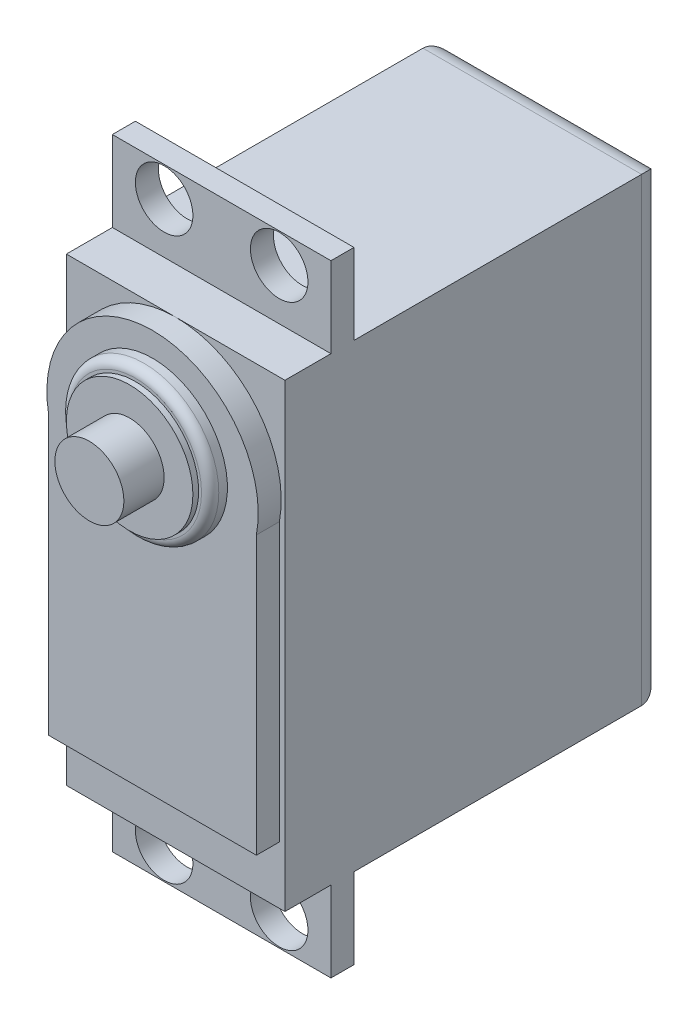
ISO-10303-21;
HEADER;
FILE_DESCRIPTION(('STEP AP214'),'2;1');
FILE_NAME('part.step','',(''),(''),'','','');
FILE_SCHEMA(('AUTOMOTIVE_DESIGN { 1 0 10303 214 1 1 1 1 }'));
ENDSEC;
DATA;
#1=APPLICATION_CONTEXT('core data for automotive mechanical design processes');
#2=APPLICATION_PROTOCOL_DEFINITION('international standard','automotive_design',2000,#1);
#3=PRODUCT_CONTEXT('',#1,'mechanical');
#4=PRODUCT('Part','Part','',(#3));
#5=PRODUCT_RELATED_PRODUCT_CATEGORY('part','',(#4));
#6=PRODUCT_DEFINITION_FORMATION('','',#4);
#7=PRODUCT_DEFINITION_CONTEXT('part definition',#1,'design');
#8=PRODUCT_DEFINITION('design','',#6,#7);
#9=PRODUCT_DEFINITION_SHAPE('','',#8);
#10=(LENGTH_UNIT() NAMED_UNIT(*) SI_UNIT(.MILLI.,.METRE.));
#11=(NAMED_UNIT(*) PLANE_ANGLE_UNIT() SI_UNIT($,.RADIAN.));
#12=(NAMED_UNIT(*) SI_UNIT($,.STERADIAN.) SOLID_ANGLE_UNIT());
#13=UNCERTAINTY_MEASURE_WITH_UNIT(LENGTH_MEASURE(1.E-05),#10,'distance_accuracy_value','');
#14=(GEOMETRIC_REPRESENTATION_CONTEXT(3) GLOBAL_UNCERTAINTY_ASSIGNED_CONTEXT((#13)) GLOBAL_UNIT_ASSIGNED_CONTEXT((#10,
#11,#12)) REPRESENTATION_CONTEXT('',''));
#15=CARTESIAN_POINT('',(0.,0.,0.));
#16=DIRECTION('',(0.,0.,1.));
#17=DIRECTION('',(1.,0.,0.));
#18=AXIS2_PLACEMENT_3D('',#15,#16,#17);
#19=CARTESIAN_POINT('',(0.,31.409074500075,4.));
#20=DIRECTION('',(0.,0.,1.));
#21=DIRECTION('',(1.,0.,0.));
#22=AXIS2_PLACEMENT_3D('',#19,#20,#21);
#23=PLANE('',#22);
#24=CARTESIAN_POINT('',(0.,31.409074500075,4.));
#25=DIRECTION('',(0.,0.,1.));
#26=DIRECTION('',(1.,0.,0.));
#27=AXIS2_PLACEMENT_3D('',#24,#25,#26);
#28=CIRCLE('',#27,5.5);
#29=CARTESIAN_POINT('',(5.5,31.409074500075,4.));
#30=VERTEX_POINT('',#29);
#31=EDGE_CURVE('E318',#30,#30,#28,.T.);
#32=ORIENTED_EDGE('',*,*,#31,.T.);
#33=EDGE_LOOP('',(#32));
#34=FACE_BOUND('',#33,.T.);
#35=CARTESIAN_POINT('',(0.,31.409074500075,4.));
#36=DIRECTION('',(0.,0.,1.));
#37=DIRECTION('',(1.,0.,0.));
#38=AXIS2_PLACEMENT_3D('',#35,#36,#37);
#39=CIRCLE('',#38,3.);
#40=CARTESIAN_POINT('',(3.,31.409074500075,4.));
#41=VERTEX_POINT('',#40);
#42=EDGE_CURVE('E523',#41,#41,#39,.T.);
#43=ORIENTED_EDGE('',*,*,#42,.F.);
#44=EDGE_LOOP('',(#43));
#45=FACE_BOUND('',#44,.T.);
#46=ADVANCED_FACE('F34',(#34,#45),#23,.T.);
#47=CARTESIAN_POINT('',(0.,31.409074500075,3.5));
#48=DIRECTION('',(0.,0.,1.));
#49=DIRECTION('',(1.,0.,0.));
#50=AXIS2_PLACEMENT_3D('',#47,#48,#49);
#51=PLANE('',#50);
#52=CARTESIAN_POINT('',(0.,31.409074500075,3.5));
#53=DIRECTION('',(0.,0.,1.));
#54=DIRECTION('',(1.,0.,0.));
#55=AXIS2_PLACEMENT_3D('',#52,#53,#54);
#56=CIRCLE('',#55,5.75);
#57=CARTESIAN_POINT('',(5.75,31.409074500075,3.5));
#58=VERTEX_POINT('',#57);
#59=EDGE_CURVE('E42',#58,#58,#56,.T.);
#60=ORIENTED_EDGE('',*,*,#59,.T.);
#61=EDGE_LOOP('',(#60));
#62=FACE_BOUND('',#61,.T.);
#63=CARTESIAN_POINT('',(0.,31.409074500075,3.5));
#64=DIRECTION('',(0.,0.,1.));
#65=DIRECTION('',(1.,0.,0.));
#66=AXIS2_PLACEMENT_3D('',#63,#64,#65);
#67=CIRCLE('',#66,5.5);
#68=CARTESIAN_POINT('',(5.5,31.409074500075,3.5));
#69=VERTEX_POINT('',#68);
#70=EDGE_CURVE('E518',#69,#69,#67,.T.);
#71=ORIENTED_EDGE('',*,*,#70,.F.);
#72=EDGE_LOOP('',(#71));
#73=FACE_BOUND('',#72,.T.);
#74=ADVANCED_FACE('F330',(#62,#73),#51,.T.);
#75=CARTESIAN_POINT('',(-0.00799327561285847,30.8138414603454,2.));
#76=DIRECTION('',(0.,0.,-1.));
#77=DIRECTION('',(-1.,0.,0.));
#78=AXIS2_PLACEMENT_3D('',#75,#76,#77);
#79=PLANE('',#78);
#80=DIRECTION('',(0.,-1.,0.));
#81=VECTOR('',#80,1.);
#82=CARTESIAN_POINT('',(-9.03493235362916,5.,2.));
#83=LINE('',#82,#81);
#84=CARTESIAN_POINT('',(-9.03493235362916,29.1109381755252,2.));
#85=VERTEX_POINT('',#84);
#86=CARTESIAN_POINT('',(-9.03493235362916,5.,2.));
#87=VERTEX_POINT('',#86);
#88=EDGE_CURVE('E175',#85,#87,#83,.T.);
#89=ORIENTED_EDGE('',*,*,#88,.T.);
#90=DIRECTION('',(1.,0.,0.));
#91=VECTOR('',#90,1.);
#92=CARTESIAN_POINT('',(-9.03493235362916,5.,2.));
#93=LINE('',#92,#91);
#94=CARTESIAN_POINT('',(9.01894580240345,5.,2.));
#95=VERTEX_POINT('',#94);
#96=EDGE_CURVE('E163',#87,#95,#93,.T.);
#97=ORIENTED_EDGE('',*,*,#96,.T.);
#98=DIRECTION('',(0.,1.,0.));
#99=VECTOR('',#98,1.);
#100=CARTESIAN_POINT('',(9.01894580240345,5.,2.));
#101=LINE('',#100,#99);
#102=CARTESIAN_POINT('',(9.01894580240345,29.1109381755252,2.));
#103=VERTEX_POINT('',#102);
#104=EDGE_CURVE('E174',#95,#103,#101,.T.);
#105=ORIENTED_EDGE('',*,*,#104,.T.);
#106=CARTESIAN_POINT('',(-0.00799327561285847,30.8138414603454,2.));
#107=DIRECTION('',(0.,0.,1.));
#108=DIRECTION('',(-1.,0.,0.));
#109=AXIS2_PLACEMENT_3D('',#106,#107,#108);
#110=CIRCLE('',#109,9.18615853965461);
#111=EDGE_CURVE('E181',#103,#85,#110,.T.);
#112=ORIENTED_EDGE('',*,*,#111,.T.);
#113=EDGE_LOOP('',(#89,#97,#105,#112));
#114=FACE_BOUND('',#113,.T.);
#115=CARTESIAN_POINT('',(0.,31.409074500075,2.));
#116=DIRECTION('',(0.,0.,-1.));
#117=DIRECTION('',(-1.,0.,0.));
#118=AXIS2_PLACEMENT_3D('',#115,#116,#117);
#119=CIRCLE('',#118,6.5);
#120=CARTESIAN_POINT('',(-6.5,31.409074500075,2.));
#121=VERTEX_POINT('',#120);
#122=EDGE_CURVE('E314',#121,#121,#119,.F.);
#123=ORIENTED_EDGE('',*,*,#122,.F.);
#124=EDGE_LOOP('',(#123));
#125=FACE_BOUND('',#124,.T.);
#126=ADVANCED_FACE('F178',(#114,#125),#79,.F.);
#127=CARTESIAN_POINT('',(9.5,0.,0.));
#128=DIRECTION('',(0.,0.,-1.));
#129=DIRECTION('',(-1.,0.,0.));
#130=AXIS2_PLACEMENT_3D('',#127,#128,#129);
#131=PLANE('',#130);
#132=CARTESIAN_POINT('',(-0.00799327561285847,30.8138414603454,0.));
#133=DIRECTION('',(0.,0.,1.));
#134=DIRECTION('',(-1.,0.,0.));
#135=AXIS2_PLACEMENT_3D('',#132,#133,#134);
#136=CIRCLE('',#135,9.18615853965461);
#137=CARTESIAN_POINT('',(-0.00799327561285847,40.,0.));
#138=VERTEX_POINT('',#137);
#139=CARTESIAN_POINT('',(-9.03493235362916,29.1109381755252,0.));
#140=VERTEX_POINT('',#139);
#141=EDGE_CURVE('E293',#138,#140,#136,.T.);
#142=ORIENTED_EDGE('',*,*,#141,.F.);
#143=DIRECTION('',(-1.,0.,0.));
#144=VECTOR('',#143,1.);
#145=CARTESIAN_POINT('',(9.5,40.,0.));
#146=LINE('',#145,#144);
#147=CARTESIAN_POINT('',(-9.5,40.,0.));
#148=VERTEX_POINT('',#147);
#149=EDGE_CURVE('E239',#138,#148,#146,.T.);
#150=ORIENTED_EDGE('',*,*,#149,.T.);
#151=DIRECTION('',(0.,-1.,0.));
#152=VECTOR('',#151,1.);
#153=CARTESIAN_POINT('',(-9.5,0.,0.));
#154=LINE('',#153,#152);
#155=CARTESIAN_POINT('',(-9.5,0.,0.));
#156=VERTEX_POINT('',#155);
#157=EDGE_CURVE('E214',#148,#156,#154,.T.);
#158=ORIENTED_EDGE('',*,*,#157,.T.);
#159=DIRECTION('',(-1.,0.,0.));
#160=VECTOR('',#159,1.);
#161=CARTESIAN_POINT('',(9.5,0.,0.));
#162=LINE('',#161,#160);
#163=CARTESIAN_POINT('',(9.5,0.,0.));
#164=VERTEX_POINT('',#163);
#165=EDGE_CURVE('E290',#164,#156,#162,.T.);
#166=ORIENTED_EDGE('',*,*,#165,.F.);
#167=DIRECTION('',(0.,-1.,0.));
#168=VECTOR('',#167,1.);
#169=CARTESIAN_POINT('',(9.5,0.,0.));
#170=LINE('',#169,#168);
#171=CARTESIAN_POINT('',(9.5,40.,0.));
#172=VERTEX_POINT('',#171);
#173=EDGE_CURVE('E215',#172,#164,#170,.T.);
#174=ORIENTED_EDGE('',*,*,#173,.F.);
#175=EDGE_CURVE('E263',#172,#138,#146,.T.);
#176=ORIENTED_EDGE('',*,*,#175,.T.);
#177=CARTESIAN_POINT('',(9.01894580240345,29.1109381755252,0.));
#178=VERTEX_POINT('',#177);
#179=EDGE_CURVE('E185',#178,#138,#136,.T.);
#180=ORIENTED_EDGE('',*,*,#179,.F.);
#181=DIRECTION('',(0.,1.,0.));
#182=VECTOR('',#181,1.);
#183=CARTESIAN_POINT('',(9.01894580240345,5.,0.));
#184=LINE('',#183,#182);
#185=CARTESIAN_POINT('',(9.01894580240345,5.,0.));
#186=VERTEX_POINT('',#185);
#187=EDGE_CURVE('E507',#186,#178,#184,.T.);
#188=ORIENTED_EDGE('',*,*,#187,.F.);
#189=DIRECTION('',(1.,0.,0.));
#190=VECTOR('',#189,1.);
#191=CARTESIAN_POINT('',(-9.03493235362916,5.,0.));
#192=LINE('',#191,#190);
#193=CARTESIAN_POINT('',(-9.03493235362916,5.,0.));
#194=VERTEX_POINT('',#193);
#195=EDGE_CURVE('E509',#194,#186,#192,.T.);
#196=ORIENTED_EDGE('',*,*,#195,.F.);
#197=DIRECTION('',(0.,-1.,0.));
#198=VECTOR('',#197,1.);
#199=CARTESIAN_POINT('',(-9.03493235362916,5.,0.));
#200=LINE('',#199,#198);
#201=EDGE_CURVE('E188',#140,#194,#200,.T.);
#202=ORIENTED_EDGE('',*,*,#201,.F.);
#203=EDGE_LOOP('',(#142,#150,#158,#166,#174,#176,#180,#188,#196,#202));
#204=FACE_BOUND('',#203,.T.);
#205=ADVANCED_FACE('F362',(#204),#131,.F.);
#206=CARTESIAN_POINT('',(9.5,0.,0.));
#207=DIRECTION('',(0.,1.,0.));
#208=DIRECTION('',(0.,0.,1.));
#209=AXIS2_PLACEMENT_3D('',#206,#207,#208);
#210=PLANE('',#209);
#211=DIRECTION('',(0.,0.,-1.));
#212=VECTOR('',#211,1.);
#213=CARTESIAN_POINT('',(-9.5,0.,0.));
#214=LINE('',#213,#212);
#215=CARTESIAN_POINT('',(-9.5,0.,-4.));
#216=VERTEX_POINT('',#215);
#217=EDGE_CURVE('E242',#156,#216,#214,.T.);
#218=ORIENTED_EDGE('',*,*,#217,.T.);
#219=DIRECTION('',(-1.,0.,0.));
#220=VECTOR('',#219,1.);
#221=CARTESIAN_POINT('',(9.5,0.,-4.));
#222=LINE('',#221,#220);
#223=CARTESIAN_POINT('',(9.5,0.,-4.));
#224=VERTEX_POINT('',#223);
#225=EDGE_CURVE('E287',#224,#216,#222,.T.);
#226=ORIENTED_EDGE('',*,*,#225,.F.);
#227=DIRECTION('',(0.,0.,-1.));
#228=VECTOR('',#227,1.);
#229=CARTESIAN_POINT('',(9.5,0.,0.));
#230=LINE('',#229,#228);
#231=EDGE_CURVE('E218',#164,#224,#230,.T.);
#232=ORIENTED_EDGE('',*,*,#231,.F.);
#233=ORIENTED_EDGE('',*,*,#165,.T.);
#234=EDGE_LOOP('',(#218,#226,#232,#233));
#235=FACE_BOUND('',#234,.T.);
#236=ADVANCED_FACE('F437',(#235),#210,.F.);
#237=CARTESIAN_POINT('',(9.5,0.,-4.));
#238=DIRECTION('',(0.,0.,-1.));
#239=DIRECTION('',(0.,1.,0.));
#240=AXIS2_PLACEMENT_3D('',#237,#238,#239);
#241=PLANE('',#240);
#242=CARTESIAN_POINT('',(-5.,-4.4,-4.));
#243=DIRECTION('',(0.,0.,1.));
#244=DIRECTION('',(1.,0.,0.));
#245=AXIS2_PLACEMENT_3D('',#242,#243,#244);
#246=CIRCLE('',#245,2.5);
#247=CARTESIAN_POINT('',(-2.5,-4.4,-4.));
#248=VERTEX_POINT('',#247);
#249=EDGE_CURVE('E189',#248,#248,#246,.T.);
#250=ORIENTED_EDGE('',*,*,#249,.F.);
#251=EDGE_LOOP('',(#250));
#252=FACE_BOUND('',#251,.T.);
#253=CARTESIAN_POINT('',(5.,-4.4,-4.));
#254=DIRECTION('',(0.,0.,1.));
#255=DIRECTION('',(-1.,0.,0.));
#256=AXIS2_PLACEMENT_3D('',#253,#254,#255);
#257=CIRCLE('',#256,2.5);
#258=CARTESIAN_POINT('',(2.5,-4.4,-4.));
#259=VERTEX_POINT('',#258);
#260=EDGE_CURVE('E198',#259,#259,#257,.T.);
#261=ORIENTED_EDGE('',*,*,#260,.F.);
#262=EDGE_LOOP('',(#261));
#263=FACE_BOUND('',#262,.T.);
#264=DIRECTION('',(0.,-1.,0.));
#265=VECTOR('',#264,1.);
#266=CARTESIAN_POINT('',(-9.5,0.,-4.));
#267=LINE('',#266,#265);
#268=CARTESIAN_POINT('',(-9.5,-7.,-4.));
#269=VERTEX_POINT('',#268);
#270=EDGE_CURVE('E244',#216,#269,#267,.T.);
#271=ORIENTED_EDGE('',*,*,#270,.T.);
#272=DIRECTION('',(-1.,0.,0.));
#273=VECTOR('',#272,1.);
#274=CARTESIAN_POINT('',(9.5,-7.,-4.));
#275=LINE('',#274,#273);
#276=CARTESIAN_POINT('',(9.5,-7.,-4.));
#277=VERTEX_POINT('',#276);
#278=EDGE_CURVE('E284',#277,#269,#275,.T.);
#279=ORIENTED_EDGE('',*,*,#278,.F.);
#280=DIRECTION('',(0.,-1.,0.));
#281=VECTOR('',#280,1.);
#282=CARTESIAN_POINT('',(9.5,0.,-4.));
#283=LINE('',#282,#281);
#284=EDGE_CURVE('E221',#224,#277,#283,.T.);
#285=ORIENTED_EDGE('',*,*,#284,.F.);
#286=ORIENTED_EDGE('',*,*,#225,.T.);
#287=EDGE_LOOP('',(#271,#279,#285,#286));
#288=FACE_BOUND('',#287,.T.);
#289=ADVANCED_FACE('F433',(#252,#263,#288),#241,.F.);
#290=CARTESIAN_POINT('',(9.5,-7.,-4.));
#291=DIRECTION('',(0.,1.,0.));
#292=DIRECTION('',(0.,0.,1.));
#293=AXIS2_PLACEMENT_3D('',#290,#291,#292);
#294=PLANE('',#293);
#295=DIRECTION('',(0.,0.,-1.));
#296=VECTOR('',#295,1.);
#297=CARTESIAN_POINT('',(-9.5,-7.,-4.));
#298=LINE('',#297,#296);
#299=CARTESIAN_POINT('',(-9.5,-7.,-6.));
#300=VERTEX_POINT('',#299);
#301=EDGE_CURVE('E246',#269,#300,#298,.T.);
#302=ORIENTED_EDGE('',*,*,#301,.T.);
#303=DIRECTION('',(-1.,0.,0.));
#304=VECTOR('',#303,1.);
#305=CARTESIAN_POINT('',(9.5,-7.,-6.));
#306=LINE('',#305,#304);
#307=CARTESIAN_POINT('',(9.5,-7.,-6.));
#308=VERTEX_POINT('',#307);
#309=EDGE_CURVE('E281',#308,#300,#306,.T.);
#310=ORIENTED_EDGE('',*,*,#309,.F.);
#311=DIRECTION('',(0.,0.,-1.));
#312=VECTOR('',#311,1.);
#313=CARTESIAN_POINT('',(9.5,-7.,-4.));
#314=LINE('',#313,#312);
#315=EDGE_CURVE('E223',#277,#308,#314,.T.);
#316=ORIENTED_EDGE('',*,*,#315,.F.);
#317=ORIENTED_EDGE('',*,*,#278,.T.);
#318=EDGE_LOOP('',(#302,#310,#316,#317));
#319=FACE_BOUND('',#318,.T.);
#320=ADVANCED_FACE('F429',(#319),#294,.F.);
#321=CARTESIAN_POINT('',(9.5,-7.,-6.));
#322=DIRECTION('',(0.,0.,1.));
#323=DIRECTION('',(1.,0.,0.));
#324=AXIS2_PLACEMENT_3D('',#321,#322,#323);
#325=PLANE('',#324);
#326=CARTESIAN_POINT('',(-5.,-4.4,-6.));
#327=DIRECTION('',(0.,0.,1.));
#328=DIRECTION('',(1.,0.,0.));
#329=AXIS2_PLACEMENT_3D('',#326,#327,#328);
#330=CIRCLE('',#329,2.5);
#331=CARTESIAN_POINT('',(-2.5,-4.4,-6.));
#332=VERTEX_POINT('',#331);
#333=EDGE_CURVE('E192',#332,#332,#330,.T.);
#334=ORIENTED_EDGE('',*,*,#333,.T.);
#335=EDGE_LOOP('',(#334));
#336=FACE_BOUND('',#335,.T.);
#337=CARTESIAN_POINT('',(5.,-4.4,-6.));
#338=DIRECTION('',(0.,0.,1.));
#339=DIRECTION('',(1.,0.,0.));
#340=AXIS2_PLACEMENT_3D('',#337,#338,#339);
#341=CIRCLE('',#340,2.5);
#342=CARTESIAN_POINT('',(7.5,-4.4,-6.));
#343=VERTEX_POINT('',#342);
#344=EDGE_CURVE('E201',#343,#343,#341,.T.);
#345=ORIENTED_EDGE('',*,*,#344,.T.);
#346=EDGE_LOOP('',(#345));
#347=FACE_BOUND('',#346,.T.);
#348=DIRECTION('',(0.,1.,0.));
#349=VECTOR('',#348,1.);
#350=CARTESIAN_POINT('',(-9.5,-7.,-6.));
#351=LINE('',#350,#349);
#352=CARTESIAN_POINT('',(-9.5,0.,-6.));
#353=VERTEX_POINT('',#352);
#354=EDGE_CURVE('E248',#300,#353,#351,.T.);
#355=ORIENTED_EDGE('',*,*,#354,.T.);
#356=DIRECTION('',(-1.,0.,0.));
#357=VECTOR('',#356,1.);
#358=CARTESIAN_POINT('',(9.5,0.,-6.));
#359=LINE('',#358,#357);
#360=CARTESIAN_POINT('',(9.5,0.,-6.));
#361=VERTEX_POINT('',#360);
#362=EDGE_CURVE('E278',#361,#353,#359,.T.);
#363=ORIENTED_EDGE('',*,*,#362,.F.);
#364=DIRECTION('',(0.,1.,0.));
#365=VECTOR('',#364,1.);
#366=CARTESIAN_POINT('',(9.5,-7.,-6.));
#367=LINE('',#366,#365);
#368=EDGE_CURVE('E225',#308,#361,#367,.T.);
#369=ORIENTED_EDGE('',*,*,#368,.F.);
#370=ORIENTED_EDGE('',*,*,#309,.T.);
#371=EDGE_LOOP('',(#355,#363,#369,#370));
#372=FACE_BOUND('',#371,.T.);
#373=ADVANCED_FACE('F425',(#336,#347,#372),#325,.F.);
#374=CARTESIAN_POINT('',(9.5,0.,-6.));
#375=DIRECTION('',(0.,1.,0.));
#376=DIRECTION('',(0.,0.,1.));
#377=AXIS2_PLACEMENT_3D('',#374,#375,#376);
#378=PLANE('',#377);
#379=DIRECTION('',(0.,0.,-1.));
#380=VECTOR('',#379,1.);
#381=CARTESIAN_POINT('',(-9.5,0.,-6.));
#382=LINE('',#381,#380);
#383=CARTESIAN_POINT('',(-9.5,0.,-31.));
#384=VERTEX_POINT('',#383);
#385=EDGE_CURVE('E250',#353,#384,#382,.T.);
#386=ORIENTED_EDGE('',*,*,#385,.T.);
#387=DIRECTION('',(-1.,0.,0.));
#388=VECTOR('',#387,1.);
#389=CARTESIAN_POINT('',(9.5,0.,-31.));
#390=LINE('',#389,#388);
#391=CARTESIAN_POINT('',(9.5,0.,-31.));
#392=VERTEX_POINT('',#391);
#393=EDGE_CURVE('E307',#384,#392,#390,.F.);
#394=ORIENTED_EDGE('',*,*,#393,.T.);
#395=DIRECTION('',(0.,0.,-1.));
#396=VECTOR('',#395,1.);
#397=CARTESIAN_POINT('',(9.5,0.,-6.));
#398=LINE('',#397,#396);
#399=EDGE_CURVE('E227',#361,#392,#398,.T.);
#400=ORIENTED_EDGE('',*,*,#399,.F.);
#401=ORIENTED_EDGE('',*,*,#362,.T.);
#402=EDGE_LOOP('',(#386,#394,#400,#401));
#403=FACE_BOUND('',#402,.T.);
#404=ADVANCED_FACE('F421',(#403),#378,.F.);
#405=CARTESIAN_POINT('',(9.5,0.,-33.));
#406=DIRECTION('',(0.,0.,1.));
#407=DIRECTION('',(1.,0.,0.));
#408=AXIS2_PLACEMENT_3D('',#405,#406,#407);
#409=PLANE('',#408);
#410=DIRECTION('',(0.,1.,0.));
#411=VECTOR('',#410,1.);
#412=CARTESIAN_POINT('',(7.5,0.,-33.));
#413=LINE('',#412,#411);
#414=CARTESIAN_POINT('',(7.5,38.,-33.));
#415=VERTEX_POINT('',#414);
#416=CARTESIAN_POINT('',(7.5,2.,-33.));
#417=VERTEX_POINT('',#416);
#418=EDGE_CURVE('E302',#415,#417,#413,.F.);
#419=ORIENTED_EDGE('',*,*,#418,.T.);
#420=DIRECTION('',(-1.,0.,0.));
#421=VECTOR('',#420,1.);
#422=CARTESIAN_POINT('',(9.5,2.,-33.));
#423=LINE('',#422,#421);
#424=CARTESIAN_POINT('',(-7.5,2.,-33.));
#425=VERTEX_POINT('',#424);
#426=EDGE_CURVE('E304',#417,#425,#423,.T.);
#427=ORIENTED_EDGE('',*,*,#426,.T.);
#428=DIRECTION('',(0.,1.,0.));
#429=VECTOR('',#428,1.);
#430=CARTESIAN_POINT('',(-7.5,40.,-33.));
#431=LINE('',#430,#429);
#432=CARTESIAN_POINT('',(-7.5,38.,-33.));
#433=VERTEX_POINT('',#432);
#434=EDGE_CURVE('E298',#425,#433,#431,.T.);
#435=ORIENTED_EDGE('',*,*,#434,.T.);
#436=DIRECTION('',(-1.,0.,0.));
#437=VECTOR('',#436,1.);
#438=CARTESIAN_POINT('',(9.5,38.,-33.));
#439=LINE('',#438,#437);
#440=EDGE_CURVE('E300',#433,#415,#439,.F.);
#441=ORIENTED_EDGE('',*,*,#440,.T.);
#442=EDGE_LOOP('',(#419,#427,#435,#441));
#443=FACE_BOUND('',#442,.T.);
#444=ADVANCED_FACE('F418',(#443),#409,.F.);
#445=CARTESIAN_POINT('',(9.5,40.,-6.));
#446=DIRECTION('',(0.,-1.,0.));
#447=DIRECTION('',(0.,0.,-1.));
#448=AXIS2_PLACEMENT_3D('',#445,#446,#447);
#449=PLANE('',#448);
#450=DIRECTION('',(0.,0.,1.));
#451=VECTOR('',#450,1.);
#452=CARTESIAN_POINT('',(9.5,40.,-6.));
#453=LINE('',#452,#451);
#454=CARTESIAN_POINT('',(9.5,40.,-31.));
#455=VERTEX_POINT('',#454);
#456=CARTESIAN_POINT('',(9.5,40.,-6.));
#457=VERTEX_POINT('',#456);
#458=EDGE_CURVE('E229',#455,#457,#453,.T.);
#459=ORIENTED_EDGE('',*,*,#458,.F.);
#460=DIRECTION('',(-1.,0.,0.));
#461=VECTOR('',#460,1.);
#462=CARTESIAN_POINT('',(9.5,40.,-31.));
#463=LINE('',#462,#461);
#464=CARTESIAN_POINT('',(-9.5,40.,-31.));
#465=VERTEX_POINT('',#464);
#466=EDGE_CURVE('E49',#455,#465,#463,.T.);
#467=ORIENTED_EDGE('',*,*,#466,.T.);
#468=DIRECTION('',(0.,0.,1.));
#469=VECTOR('',#468,1.);
#470=CARTESIAN_POINT('',(-9.5,40.,-6.));
#471=LINE('',#470,#469);
#472=CARTESIAN_POINT('',(-9.5,40.,-6.));
#473=VERTEX_POINT('',#472);
#474=EDGE_CURVE('E253',#465,#473,#471,.T.);
#475=ORIENTED_EDGE('',*,*,#474,.T.);
#476=DIRECTION('',(-1.,0.,0.));
#477=VECTOR('',#476,1.);
#478=CARTESIAN_POINT('',(9.5,40.,-6.));
#479=LINE('',#478,#477);
#480=EDGE_CURVE('E275',#457,#473,#479,.T.);
#481=ORIENTED_EDGE('',*,*,#480,.F.);
#482=EDGE_LOOP('',(#459,#467,#475,#481));
#483=FACE_BOUND('',#482,.T.);
#484=ADVANCED_FACE('F414',(#483),#449,.F.);
#485=CARTESIAN_POINT('',(9.5,47.,-6.));
#486=DIRECTION('',(0.,0.,1.));
#487=DIRECTION('',(1.,0.,0.));
#488=AXIS2_PLACEMENT_3D('',#485,#486,#487);
#489=PLANE('',#488);
#490=CARTESIAN_POINT('',(-5.,44.4,-6.));
#491=DIRECTION('',(0.,0.,1.));
#492=DIRECTION('',(1.,0.,0.));
#493=AXIS2_PLACEMENT_3D('',#490,#491,#492);
#494=CIRCLE('',#493,2.5);
#495=CARTESIAN_POINT('',(-2.5,44.4,-6.));
#496=VERTEX_POINT('',#495);
#497=EDGE_CURVE('E205',#496,#496,#494,.T.);
#498=ORIENTED_EDGE('',*,*,#497,.T.);
#499=EDGE_LOOP('',(#498));
#500=FACE_BOUND('',#499,.T.);
#501=CARTESIAN_POINT('',(5.,44.4,-6.));
#502=DIRECTION('',(0.,0.,1.));
#503=DIRECTION('',(1.,0.,0.));
#504=AXIS2_PLACEMENT_3D('',#501,#502,#503);
#505=CIRCLE('',#504,2.5);
#506=CARTESIAN_POINT('',(7.5,44.4,-6.));
#507=VERTEX_POINT('',#506);
#508=EDGE_CURVE('E211',#507,#507,#505,.T.);
#509=ORIENTED_EDGE('',*,*,#508,.T.);
#510=EDGE_LOOP('',(#509));
#511=FACE_BOUND('',#510,.T.);
#512=DIRECTION('',(0.,1.,0.));
#513=VECTOR('',#512,1.);
#514=CARTESIAN_POINT('',(-9.5,47.,-6.));
#515=LINE('',#514,#513);
#516=CARTESIAN_POINT('',(-9.5,47.,-6.));
#517=VERTEX_POINT('',#516);
#518=EDGE_CURVE('E255',#473,#517,#515,.T.);
#519=ORIENTED_EDGE('',*,*,#518,.T.);
#520=DIRECTION('',(-1.,0.,0.));
#521=VECTOR('',#520,1.);
#522=CARTESIAN_POINT('',(9.5,47.,-6.));
#523=LINE('',#522,#521);
#524=CARTESIAN_POINT('',(9.5,47.,-6.));
#525=VERTEX_POINT('',#524);
#526=EDGE_CURVE('E272',#525,#517,#523,.T.);
#527=ORIENTED_EDGE('',*,*,#526,.F.);
#528=DIRECTION('',(0.,1.,0.));
#529=VECTOR('',#528,1.);
#530=CARTESIAN_POINT('',(9.5,47.,-6.));
#531=LINE('',#530,#529);
#532=EDGE_CURVE('E231',#457,#525,#531,.T.);
#533=ORIENTED_EDGE('',*,*,#532,.F.);
#534=ORIENTED_EDGE('',*,*,#480,.T.);
#535=EDGE_LOOP('',(#519,#527,#533,#534));
#536=FACE_BOUND('',#535,.T.);
#537=ADVANCED_FACE('F410',(#500,#511,#536),#489,.F.);
#538=CARTESIAN_POINT('',(9.5,47.,-4.));
#539=DIRECTION('',(0.,-1.,0.));
#540=DIRECTION('',(0.,0.,-1.));
#541=AXIS2_PLACEMENT_3D('',#538,#539,#540);
#542=PLANE('',#541);
#543=DIRECTION('',(0.,0.,1.));
#544=VECTOR('',#543,1.);
#545=CARTESIAN_POINT('',(-9.5,47.,-4.));
#546=LINE('',#545,#544);
#547=CARTESIAN_POINT('',(-9.5,47.,-4.));
#548=VERTEX_POINT('',#547);
#549=EDGE_CURVE('E257',#517,#548,#546,.T.);
#550=ORIENTED_EDGE('',*,*,#549,.T.);
#551=DIRECTION('',(-1.,0.,0.));
#552=VECTOR('',#551,1.);
#553=CARTESIAN_POINT('',(9.5,47.,-4.));
#554=LINE('',#553,#552);
#555=CARTESIAN_POINT('',(9.5,47.,-4.));
#556=VERTEX_POINT('',#555);
#557=EDGE_CURVE('E269',#556,#548,#554,.T.);
#558=ORIENTED_EDGE('',*,*,#557,.F.);
#559=DIRECTION('',(0.,0.,1.));
#560=VECTOR('',#559,1.);
#561=CARTESIAN_POINT('',(9.5,47.,-4.));
#562=LINE('',#561,#560);
#563=EDGE_CURVE('E233',#525,#556,#562,.T.);
#564=ORIENTED_EDGE('',*,*,#563,.F.);
#565=ORIENTED_EDGE('',*,*,#526,.T.);
#566=EDGE_LOOP('',(#550,#558,#564,#565));
#567=FACE_BOUND('',#566,.T.);
#568=ADVANCED_FACE('F406',(#567),#542,.F.);
#569=CARTESIAN_POINT('',(9.5,40.,-4.));
#570=DIRECTION('',(0.,0.,-1.));
#571=DIRECTION('',(0.,1.,0.));
#572=AXIS2_PLACEMENT_3D('',#569,#570,#571);
#573=PLANE('',#572);
#574=CARTESIAN_POINT('',(-5.,44.4,-4.));
#575=DIRECTION('',(0.,0.,1.));
#576=DIRECTION('',(-1.,0.,0.));
#577=AXIS2_PLACEMENT_3D('',#574,#575,#576);
#578=CIRCLE('',#577,2.5);
#579=CARTESIAN_POINT('',(-7.5,44.4,-4.));
#580=VERTEX_POINT('',#579);
#581=EDGE_CURVE('E202',#580,#580,#578,.T.);
#582=ORIENTED_EDGE('',*,*,#581,.F.);
#583=EDGE_LOOP('',(#582));
#584=FACE_BOUND('',#583,.T.);
#585=CARTESIAN_POINT('',(5.,44.4,-4.));
#586=DIRECTION('',(0.,0.,1.));
#587=DIRECTION('',(1.,0.,0.));
#588=AXIS2_PLACEMENT_3D('',#585,#586,#587);
#589=CIRCLE('',#588,2.5);
#590=CARTESIAN_POINT('',(7.5,44.4,-4.));
#591=VERTEX_POINT('',#590);
#592=EDGE_CURVE('E208',#591,#591,#589,.T.);
#593=ORIENTED_EDGE('',*,*,#592,.F.);
#594=EDGE_LOOP('',(#593));
#595=FACE_BOUND('',#594,.T.);
#596=DIRECTION('',(0.,-1.,0.));
#597=VECTOR('',#596,1.);
#598=CARTESIAN_POINT('',(-9.5,40.,-4.));
#599=LINE('',#598,#597);
#600=CARTESIAN_POINT('',(-9.5,40.,-4.));
#601=VERTEX_POINT('',#600);
#602=EDGE_CURVE('E259',#548,#601,#599,.T.);
#603=ORIENTED_EDGE('',*,*,#602,.T.);
#604=DIRECTION('',(-1.,0.,0.));
#605=VECTOR('',#604,1.);
#606=CARTESIAN_POINT('',(9.5,40.,-4.));
#607=LINE('',#606,#605);
#608=CARTESIAN_POINT('',(9.5,40.,-4.));
#609=VERTEX_POINT('',#608);
#610=EDGE_CURVE('E266',#609,#601,#607,.T.);
#611=ORIENTED_EDGE('',*,*,#610,.F.);
#612=DIRECTION('',(0.,-1.,0.));
#613=VECTOR('',#612,1.);
#614=CARTESIAN_POINT('',(9.5,40.,-4.));
#615=LINE('',#614,#613);
#616=EDGE_CURVE('E235',#556,#609,#615,.T.);
#617=ORIENTED_EDGE('',*,*,#616,.F.);
#618=ORIENTED_EDGE('',*,*,#557,.T.);
#619=EDGE_LOOP('',(#603,#611,#617,#618));
#620=FACE_BOUND('',#619,.T.);
#621=ADVANCED_FACE('F402',(#584,#595,#620),#573,.F.);
#622=CARTESIAN_POINT('',(9.5,40.,0.));
#623=DIRECTION('',(0.,-1.,0.));
#624=DIRECTION('',(0.,0.,-1.));
#625=AXIS2_PLACEMENT_3D('',#622,#623,#624);
#626=PLANE('',#625);
#627=DIRECTION('',(0.,0.,1.));
#628=VECTOR('',#627,1.);
#629=CARTESIAN_POINT('',(-9.5,40.,0.));
#630=LINE('',#629,#628);
#631=EDGE_CURVE('E219',#601,#148,#630,.T.);
#632=ORIENTED_EDGE('',*,*,#631,.T.);
#633=ORIENTED_EDGE('',*,*,#149,.F.);
#634=ORIENTED_EDGE('',*,*,#175,.F.);
#635=DIRECTION('',(0.,0.,1.));
#636=VECTOR('',#635,1.);
#637=CARTESIAN_POINT('',(9.5,40.,0.));
#638=LINE('',#637,#636);
#639=EDGE_CURVE('E237',#609,#172,#638,.T.);
#640=ORIENTED_EDGE('',*,*,#639,.F.);
#641=ORIENTED_EDGE('',*,*,#610,.T.);
#642=EDGE_LOOP('',(#632,#633,#634,#640,#641));
#643=FACE_BOUND('',#642,.T.);
#644=ADVANCED_FACE('F396',(#643),#626,.F.);
#645=CARTESIAN_POINT('',(9.5,0.,0.));
#646=DIRECTION('',(-1.,0.,0.));
#647=DIRECTION('',(0.,0.,1.));
#648=AXIS2_PLACEMENT_3D('',#645,#646,#647);
#649=PLANE('',#648);
#650=ORIENTED_EDGE('',*,*,#399,.T.);
#651=DIRECTION('',(0.,1.,0.));
#652=VECTOR('',#651,1.);
#653=CARTESIAN_POINT('',(9.5,0.,-31.));
#654=LINE('',#653,#652);
#655=EDGE_CURVE('E57',#392,#455,#654,.T.);
#656=ORIENTED_EDGE('',*,*,#655,.T.);
#657=ORIENTED_EDGE('',*,*,#458,.T.);
#658=ORIENTED_EDGE('',*,*,#532,.T.);
#659=ORIENTED_EDGE('',*,*,#563,.T.);
#660=ORIENTED_EDGE('',*,*,#616,.T.);
#661=ORIENTED_EDGE('',*,*,#639,.T.);
#662=ORIENTED_EDGE('',*,*,#173,.T.);
#663=ORIENTED_EDGE('',*,*,#231,.T.);
#664=ORIENTED_EDGE('',*,*,#284,.T.);
#665=ORIENTED_EDGE('',*,*,#315,.T.);
#666=ORIENTED_EDGE('',*,*,#368,.T.);
#667=EDGE_LOOP('',(#650,#656,#657,#658,#659,#660,#661,#662,#663,#664,#665,#666));
#668=FACE_BOUND('',#667,.T.);
#669=ADVANCED_FACE('F393',(#668),#649,.F.);
#670=CARTESIAN_POINT('',(-9.5,0.,0.));
#671=DIRECTION('',(-1.,0.,0.));
#672=DIRECTION('',(0.,0.,1.));
#673=AXIS2_PLACEMENT_3D('',#670,#671,#672);
#674=PLANE('',#673);
#675=ORIENTED_EDGE('',*,*,#474,.F.);
#676=DIRECTION('',(0.,1.,0.));
#677=VECTOR('',#676,1.);
#678=CARTESIAN_POINT('',(-9.5,0.,-31.));
#679=LINE('',#678,#677);
#680=EDGE_CURVE('E312',#465,#384,#679,.F.);
#681=ORIENTED_EDGE('',*,*,#680,.T.);
#682=ORIENTED_EDGE('',*,*,#385,.F.);
#683=ORIENTED_EDGE('',*,*,#354,.F.);
#684=ORIENTED_EDGE('',*,*,#301,.F.);
#685=ORIENTED_EDGE('',*,*,#270,.F.);
#686=ORIENTED_EDGE('',*,*,#217,.F.);
#687=ORIENTED_EDGE('',*,*,#157,.F.);
#688=ORIENTED_EDGE('',*,*,#631,.F.);
#689=ORIENTED_EDGE('',*,*,#602,.F.);
#690=ORIENTED_EDGE('',*,*,#549,.F.);
#691=ORIENTED_EDGE('',*,*,#518,.F.);
#692=EDGE_LOOP('',(#675,#681,#682,#683,#684,#685,#686,#687,#688,#689,#690,#691));
#693=FACE_BOUND('',#692,.T.);
#694=ADVANCED_FACE('F391',(#693),#674,.T.);
#695=CARTESIAN_POINT('',(5.,44.4,-14.));
#696=DIRECTION('',(0.,0.,1.));
#697=DIRECTION('',(1.,0.,0.));
#698=AXIS2_PLACEMENT_3D('',#695,#696,#697);
#699=CYLINDRICAL_SURFACE('',#698,2.5);
#700=ORIENTED_EDGE('',*,*,#592,.T.);
#701=EDGE_LOOP('',(#700));
#702=FACE_BOUND('',#701,.T.);
#703=ORIENTED_EDGE('',*,*,#508,.F.);
#704=EDGE_LOOP('',(#703));
#705=FACE_BOUND('',#704,.T.);
#706=ADVANCED_FACE('F387',(#702,#705),#699,.F.);
#707=CARTESIAN_POINT('',(-5.,44.4,-14.));
#708=DIRECTION('',(0.,0.,1.));
#709=DIRECTION('',(1.,0.,0.));
#710=AXIS2_PLACEMENT_3D('',#707,#708,#709);
#711=CYLINDRICAL_SURFACE('',#710,2.5);
#712=ORIENTED_EDGE('',*,*,#581,.T.);
#713=EDGE_LOOP('',(#712));
#714=FACE_BOUND('',#713,.T.);
#715=ORIENTED_EDGE('',*,*,#497,.F.);
#716=EDGE_LOOP('',(#715));
#717=FACE_BOUND('',#716,.T.);
#718=ADVANCED_FACE('F383',(#714,#717),#711,.F.);
#719=CARTESIAN_POINT('',(5.,-4.4,-14.));
#720=DIRECTION('',(0.,0.,1.));
#721=DIRECTION('',(1.,0.,0.));
#722=AXIS2_PLACEMENT_3D('',#719,#720,#721);
#723=CYLINDRICAL_SURFACE('',#722,2.5);
#724=ORIENTED_EDGE('',*,*,#260,.T.);
#725=EDGE_LOOP('',(#724));
#726=FACE_BOUND('',#725,.T.);
#727=ORIENTED_EDGE('',*,*,#344,.F.);
#728=EDGE_LOOP('',(#727));
#729=FACE_BOUND('',#728,.T.);
#730=ADVANCED_FACE('F379',(#726,#729),#723,.F.);
#731=CARTESIAN_POINT('',(-5.,-4.4,-14.));
#732=DIRECTION('',(0.,0.,1.));
#733=DIRECTION('',(1.,0.,0.));
#734=AXIS2_PLACEMENT_3D('',#731,#732,#733);
#735=CYLINDRICAL_SURFACE('',#734,2.5);
#736=ORIENTED_EDGE('',*,*,#249,.T.);
#737=EDGE_LOOP('',(#736));
#738=FACE_BOUND('',#737,.T.);
#739=ORIENTED_EDGE('',*,*,#333,.F.);
#740=EDGE_LOOP('',(#739));
#741=FACE_BOUND('',#740,.T.);
#742=ADVANCED_FACE('F376',(#738,#741),#735,.F.);
#743=CARTESIAN_POINT('',(-9.03493235362916,5.,2.));
#744=DIRECTION('',(1.,0.,0.));
#745=DIRECTION('',(0.,0.,-1.));
#746=AXIS2_PLACEMENT_3D('',#743,#744,#745);
#747=PLANE('',#746);
#748=ORIENTED_EDGE('',*,*,#201,.T.);
#749=DIRECTION('',(0.,0.,-1.));
#750=VECTOR('',#749,1.);
#751=CARTESIAN_POINT('',(-9.03493235362916,5.,2.));
#752=LINE('',#751,#750);
#753=EDGE_CURVE('E168',#87,#194,#752,.T.);
#754=ORIENTED_EDGE('',*,*,#753,.F.);
#755=ORIENTED_EDGE('',*,*,#88,.F.);
#756=DIRECTION('',(0.,0.,-1.));
#757=VECTOR('',#756,1.);
#758=CARTESIAN_POINT('',(-9.03493235362916,29.1109381755252,2.));
#759=LINE('',#758,#757);
#760=EDGE_CURVE('E513',#85,#140,#759,.T.);
#761=ORIENTED_EDGE('',*,*,#760,.T.);
#762=EDGE_LOOP('',(#748,#754,#755,#761));
#763=FACE_BOUND('',#762,.T.);
#764=ADVANCED_FACE('F187',(#763),#747,.F.);
#765=CARTESIAN_POINT('',(-9.03493235362916,5.,2.));
#766=DIRECTION('',(0.,1.,0.));
#767=DIRECTION('',(0.,0.,1.));
#768=AXIS2_PLACEMENT_3D('',#765,#766,#767);
#769=PLANE('',#768);
#770=ORIENTED_EDGE('',*,*,#195,.T.);
#771=DIRECTION('',(0.,0.,-1.));
#772=VECTOR('',#771,1.);
#773=CARTESIAN_POINT('',(9.01894580240345,5.,2.));
#774=LINE('',#773,#772);
#775=EDGE_CURVE('E171',#95,#186,#774,.T.);
#776=ORIENTED_EDGE('',*,*,#775,.F.);
#777=ORIENTED_EDGE('',*,*,#96,.F.);
#778=ORIENTED_EDGE('',*,*,#753,.T.);
#779=EDGE_LOOP('',(#770,#776,#777,#778));
#780=FACE_BOUND('',#779,.T.);
#781=ADVANCED_FACE('F166',(#780),#769,.F.);
#782=CARTESIAN_POINT('',(9.01894580240345,5.,2.));
#783=DIRECTION('',(-1.,0.,0.));
#784=DIRECTION('',(0.,0.,1.));
#785=AXIS2_PLACEMENT_3D('',#782,#783,#784);
#786=PLANE('',#785);
#787=ORIENTED_EDGE('',*,*,#187,.T.);
#788=DIRECTION('',(0.,0.,-1.));
#789=VECTOR('',#788,1.);
#790=CARTESIAN_POINT('',(9.01894580240345,29.1109381755252,2.));
#791=LINE('',#790,#789);
#792=EDGE_CURVE('E194',#103,#178,#791,.T.);
#793=ORIENTED_EDGE('',*,*,#792,.F.);
#794=ORIENTED_EDGE('',*,*,#104,.F.);
#795=ORIENTED_EDGE('',*,*,#775,.T.);
#796=EDGE_LOOP('',(#787,#793,#794,#795));
#797=FACE_BOUND('',#796,.T.);
#798=ADVANCED_FACE('F367',(#797),#786,.F.);
#799=CARTESIAN_POINT('',(-0.00799327561285847,30.8138414603454,2.));
#800=DIRECTION('',(0.,0.,-1.));
#801=DIRECTION('',(-1.,0.,0.));
#802=AXIS2_PLACEMENT_3D('',#799,#800,#801);
#803=CYLINDRICAL_SURFACE('',#802,9.18615853965461);
#804=ORIENTED_EDGE('',*,*,#179,.T.);
#805=ORIENTED_EDGE('',*,*,#141,.T.);
#806=ORIENTED_EDGE('',*,*,#760,.F.);
#807=ORIENTED_EDGE('',*,*,#111,.F.);
#808=ORIENTED_EDGE('',*,*,#792,.T.);
#809=EDGE_LOOP('',(#804,#805,#806,#807,#808));
#810=FACE_BOUND('',#809,.T.);
#811=ADVANCED_FACE('F363',(#810),#803,.T.);
#812=CARTESIAN_POINT('',(9.5,38.,-31.));
#813=DIRECTION('',(-1.,0.,0.));
#814=DIRECTION('',(0.,0.,1.));
#815=AXIS2_PLACEMENT_3D('',#812,#813,#814);
#816=CYLINDRICAL_SURFACE('',#815,2.);
#817=CARTESIAN_POINT('',(-7.5,38.,-31.));
#818=DIRECTION('',(-0.707106781186547,-0.707106781186547,0.));
#819=DIRECTION('',(0.707106781186547,-0.707106781186547,0.));
#820=AXIS2_PLACEMENT_3D('',#817,#818,#819);
#821=ELLIPSE('',#820,2.82842712474619,2.);
#822=EDGE_CURVE('E320',#465,#433,#821,.T.);
#823=ORIENTED_EDGE('',*,*,#822,.F.);
#824=ORIENTED_EDGE('',*,*,#466,.F.);
#825=CARTESIAN_POINT('',(7.5,38.,-31.));
#826=DIRECTION('',(-0.707106781186547,0.707106781186547,0.));
#827=DIRECTION('',(-0.707106781186547,-0.707106781186547,0.));
#828=AXIS2_PLACEMENT_3D('',#825,#826,#827);
#829=ELLIPSE('',#828,2.82842712474619,2.);
#830=EDGE_CURVE('E323',#415,#455,#829,.F.);
#831=ORIENTED_EDGE('',*,*,#830,.F.);
#832=ORIENTED_EDGE('',*,*,#440,.F.);
#833=EDGE_LOOP('',(#823,#824,#831,#832));
#834=FACE_BOUND('',#833,.T.);
#835=ADVANCED_FACE('F366',(#834),#816,.T.);
#836=CARTESIAN_POINT('',(7.5,0.,-31.));
#837=DIRECTION('',(0.,1.,0.));
#838=DIRECTION('',(0.,0.,1.));
#839=AXIS2_PLACEMENT_3D('',#836,#837,#838);
#840=CYLINDRICAL_SURFACE('',#839,2.);
#841=ORIENTED_EDGE('',*,*,#830,.T.);
#842=ORIENTED_EDGE('',*,*,#655,.F.);
#843=CARTESIAN_POINT('',(7.5,2.,-31.));
#844=DIRECTION('',(0.707106781186547,0.707106781186547,0.));
#845=DIRECTION('',(-0.707106781186547,0.707106781186547,0.));
#846=AXIS2_PLACEMENT_3D('',#843,#844,#845);
#847=ELLIPSE('',#846,2.82842712474619,2.);
#848=EDGE_CURVE('E317',#417,#392,#847,.F.);
#849=ORIENTED_EDGE('',*,*,#848,.F.);
#850=ORIENTED_EDGE('',*,*,#418,.F.);
#851=EDGE_LOOP('',(#841,#842,#849,#850));
#852=FACE_BOUND('',#851,.T.);
#853=ADVANCED_FACE('F451',(#852),#840,.T.);
#854=CARTESIAN_POINT('',(-7.5,0.,-31.));
#855=DIRECTION('',(0.,-1.,0.));
#856=DIRECTION('',(0.,0.,-1.));
#857=AXIS2_PLACEMENT_3D('',#854,#855,#856);
#858=CYLINDRICAL_SURFACE('',#857,2.);
#859=ORIENTED_EDGE('',*,*,#822,.T.);
#860=ORIENTED_EDGE('',*,*,#434,.F.);
#861=CARTESIAN_POINT('',(-7.5,2.,-31.));
#862=DIRECTION('',(0.707106781186547,-0.707106781186547,0.));
#863=DIRECTION('',(-0.707106781186547,-0.707106781186547,0.));
#864=AXIS2_PLACEMENT_3D('',#861,#862,#863);
#865=ELLIPSE('',#864,2.82842712474619,2.);
#866=EDGE_CURVE('E315',#384,#425,#865,.T.);
#867=ORIENTED_EDGE('',*,*,#866,.F.);
#868=ORIENTED_EDGE('',*,*,#680,.F.);
#869=EDGE_LOOP('',(#859,#860,#867,#868));
#870=FACE_BOUND('',#869,.T.);
#871=ADVANCED_FACE('F447',(#870),#858,.T.);
#872=CARTESIAN_POINT('',(9.5,2.,-31.));
#873=DIRECTION('',(-1.,0.,0.));
#874=DIRECTION('',(0.,0.,1.));
#875=AXIS2_PLACEMENT_3D('',#872,#873,#874);
#876=CYLINDRICAL_SURFACE('',#875,2.);
#877=ORIENTED_EDGE('',*,*,#848,.T.);
#878=ORIENTED_EDGE('',*,*,#393,.F.);
#879=ORIENTED_EDGE('',*,*,#866,.T.);
#880=ORIENTED_EDGE('',*,*,#426,.F.);
#881=EDGE_LOOP('',(#877,#878,#879,#880));
#882=FACE_BOUND('',#881,.T.);
#883=ADVANCED_FACE('F344',(#882),#876,.T.);
#884=CARTESIAN_POINT('',(0.,31.409074500075,3.5));
#885=DIRECTION('',(0.,0.,-1.));
#886=DIRECTION('',(-1.,0.,0.));
#887=AXIS2_PLACEMENT_3D('',#884,#885,#886);
#888=CYLINDRICAL_SURFACE('',#887,6.5);
#889=CARTESIAN_POINT('',(0.,31.409074500075,2.75));
#890=DIRECTION('',(0.,0.,1.));
#891=DIRECTION('',(1.,0.,0.));
#892=AXIS2_PLACEMENT_3D('',#889,#890,#891);
#893=CIRCLE('',#892,6.5);
#894=CARTESIAN_POINT('',(6.5,31.409074500075,2.75));
#895=VERTEX_POINT('',#894);
#896=EDGE_CURVE('E11',#895,#895,#893,.F.);
#897=ORIENTED_EDGE('',*,*,#896,.T.);
#898=EDGE_LOOP('',(#897));
#899=FACE_BOUND('',#898,.T.);
#900=ORIENTED_EDGE('',*,*,#122,.T.);
#901=EDGE_LOOP('',(#900));
#902=FACE_BOUND('',#901,.T.);
#903=ADVANCED_FACE('F335',(#899,#902),#888,.T.);
#904=CARTESIAN_POINT('',(0.,31.409074500075,2.75));
#905=DIRECTION('',(0.,0.,1.));
#906=DIRECTION('',(1.,0.,0.));
#907=AXIS2_PLACEMENT_3D('',#904,#905,#906);
#908=TOROIDAL_SURFACE('',#907,5.75,0.75);
#909=ORIENTED_EDGE('',*,*,#896,.F.);
#910=EDGE_LOOP('',(#909));
#911=FACE_BOUND('',#910,.T.);
#912=ORIENTED_EDGE('',*,*,#59,.F.);
#913=EDGE_LOOP('',(#912));
#914=FACE_BOUND('',#913,.T.);
#915=ADVANCED_FACE('F36',(#911,#914),#908,.T.);
#916=CARTESIAN_POINT('',(0.,31.409074500075,4.));
#917=DIRECTION('',(0.,0.,-1.));
#918=DIRECTION('',(-1.,0.,0.));
#919=AXIS2_PLACEMENT_3D('',#916,#917,#918);
#920=CYLINDRICAL_SURFACE('',#919,5.5);
#921=ORIENTED_EDGE('',*,*,#31,.F.);
#922=EDGE_LOOP('',(#921));
#923=FACE_BOUND('',#922,.T.);
#924=ORIENTED_EDGE('',*,*,#70,.T.);
#925=EDGE_LOOP('',(#924));
#926=FACE_BOUND('',#925,.T.);
#927=ADVANCED_FACE('F334',(#923,#926),#920,.T.);
#928=CARTESIAN_POINT('',(0.,31.409074500075,7.5));
#929=DIRECTION('',(0.,0.,-1.));
#930=DIRECTION('',(-1.,0.,0.));
#931=AXIS2_PLACEMENT_3D('',#928,#929,#930);
#932=CYLINDRICAL_SURFACE('',#931,3.);
#933=CARTESIAN_POINT('',(0.,31.409074500075,7.5));
#934=DIRECTION('',(0.,0.,1.));
#935=DIRECTION('',(1.,0.,0.));
#936=AXIS2_PLACEMENT_3D('',#933,#934,#935);
#937=CIRCLE('',#936,3.);
#938=CARTESIAN_POINT('',(3.,31.409074500075,7.5));
#939=VERTEX_POINT('',#938);
#940=EDGE_CURVE('E521',#939,#939,#937,.T.);
#941=ORIENTED_EDGE('',*,*,#940,.F.);
#942=EDGE_LOOP('',(#941));
#943=FACE_BOUND('',#942,.T.);
#944=ORIENTED_EDGE('',*,*,#42,.T.);
#945=EDGE_LOOP('',(#944));
#946=FACE_BOUND('',#945,.T.);
#947=ADVANCED_FACE('F341',(#943,#946),#932,.T.);
#948=CARTESIAN_POINT('',(0.,31.409074500075,7.5));
#949=DIRECTION('',(0.,0.,1.));
#950=DIRECTION('',(1.,0.,0.));
#951=AXIS2_PLACEMENT_3D('',#948,#949,#950);
#952=PLANE('',#951);
#953=ORIENTED_EDGE('',*,*,#940,.T.);
#954=EDGE_LOOP('',(#953));
#955=FACE_BOUND('',#954,.T.);
#956=ADVANCED_FACE('F529',(#955),#952,.T.);
#957=CLOSED_SHELL('',(#46,#74,#126,#205,#236,#289,#320,#373,#404,#444,#484,#537,#568,#621,#644,
#669,#694,#706,#718,#730,#742,#764,#781,#798,#811,#835,#853,#871,#883,#903,#915,#927,#947,#956));
#958=MANIFOLD_SOLID_BREP('B2',#957);
#959=ADVANCED_BREP_SHAPE_REPRESENTATION('',(#18,#958),#14);
#960=SHAPE_DEFINITION_REPRESENTATION(#9,#959);
ENDSEC;
END-ISO-10303-21;
